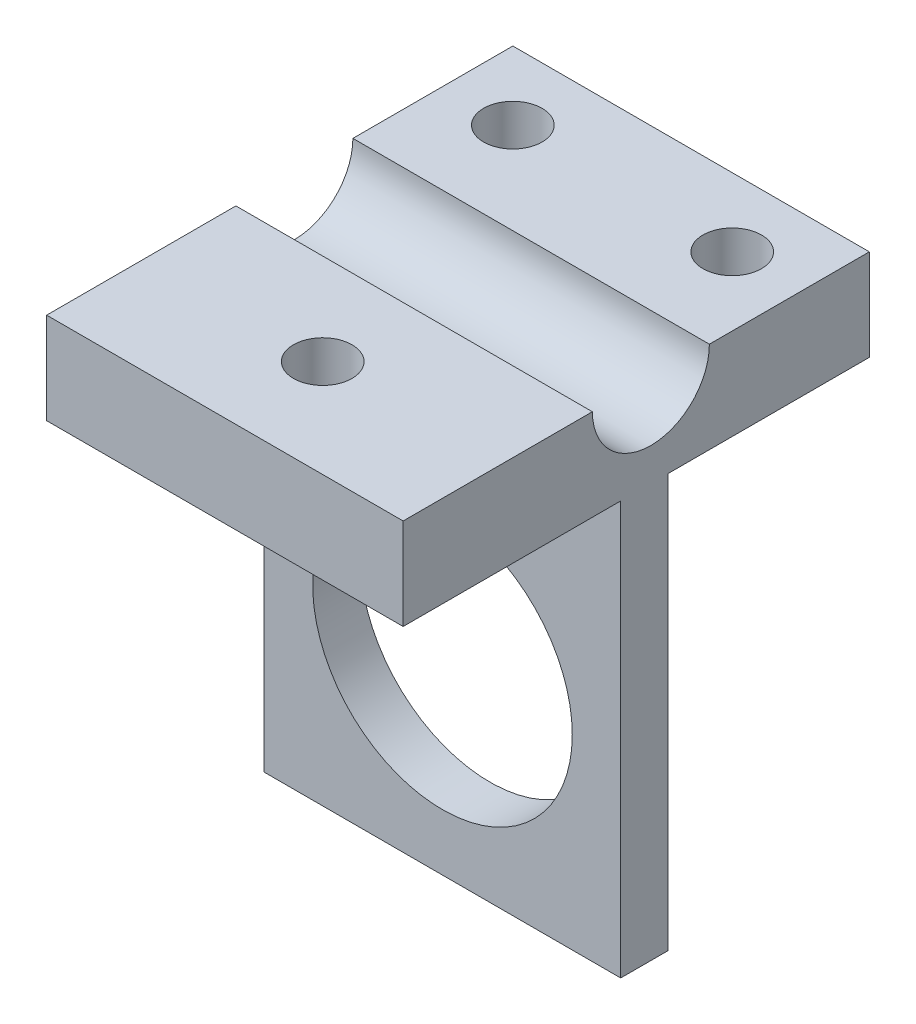
ISO-10303-21;
HEADER;
FILE_DESCRIPTION(('STEP AP214'),'2;1');
FILE_NAME('part.step','',(''),(''),'','','');
FILE_SCHEMA(('AUTOMOTIVE_DESIGN { 1 0 10303 214 1 1 1 1 }'));
ENDSEC;
DATA;
#1=APPLICATION_CONTEXT('core data for automotive mechanical design processes');
#2=APPLICATION_PROTOCOL_DEFINITION('international standard','automotive_design',2000,#1);
#3=PRODUCT_CONTEXT('',#1,'mechanical');
#4=PRODUCT('Part','Part','',(#3));
#5=PRODUCT_RELATED_PRODUCT_CATEGORY('part','',(#4));
#6=PRODUCT_DEFINITION_FORMATION('','',#4);
#7=PRODUCT_DEFINITION_CONTEXT('part definition',#1,'design');
#8=PRODUCT_DEFINITION('design','',#6,#7);
#9=PRODUCT_DEFINITION_SHAPE('','',#8);
#10=(LENGTH_UNIT() NAMED_UNIT(*) SI_UNIT(.MILLI.,.METRE.));
#11=(NAMED_UNIT(*) PLANE_ANGLE_UNIT() SI_UNIT($,.RADIAN.));
#12=(NAMED_UNIT(*) SI_UNIT($,.STERADIAN.) SOLID_ANGLE_UNIT());
#13=UNCERTAINTY_MEASURE_WITH_UNIT(LENGTH_MEASURE(1.E-05),#10,'distance_accuracy_value','');
#14=(GEOMETRIC_REPRESENTATION_CONTEXT(3) GLOBAL_UNCERTAINTY_ASSIGNED_CONTEXT((#13)) GLOBAL_UNIT_ASSIGNED_CONTEXT((#10,
#11,#12)) REPRESENTATION_CONTEXT('',''));
#15=CARTESIAN_POINT('',(0.,0.,0.));
#16=DIRECTION('',(0.,0.,1.));
#17=DIRECTION('',(1.,0.,0.));
#18=AXIS2_PLACEMENT_3D('',#15,#16,#17);
#19=CARTESIAN_POINT('',(0.,0.,0.));
#20=DIRECTION('',(0.,-1.,0.));
#21=DIRECTION('',(0.,0.,-1.));
#22=AXIS2_PLACEMENT_3D('',#19,#20,#21);
#23=PLANE('',#22);
#24=DIRECTION('',(1.,0.,0.));
#25=VECTOR('',#24,1.);
#26=CARTESIAN_POINT('',(24.765,0.,-18.415));
#27=LINE('',#26,#25);
#28=CARTESIAN_POINT('',(0.,0.,-18.415));
#29=VERTEX_POINT('',#28);
#30=CARTESIAN_POINT('',(24.765,0.,-18.415));
#31=VERTEX_POINT('',#30);
#32=EDGE_CURVE('E140',#29,#31,#27,.T.);
#33=ORIENTED_EDGE('',*,*,#32,.F.);
#34=DIRECTION('',(0.,0.,1.));
#35=VECTOR('',#34,1.);
#36=CARTESIAN_POINT('',(0.,0.,0.));
#37=LINE('',#36,#35);
#38=CARTESIAN_POINT('',(0.,0.,-32.385));
#39=VERTEX_POINT('',#38);
#40=EDGE_CURVE('E191',#39,#29,#37,.T.);
#41=ORIENTED_EDGE('',*,*,#40,.F.);
#42=DIRECTION('',(-1.,0.,0.));
#43=VECTOR('',#42,1.);
#44=CARTESIAN_POINT('',(0.,0.,-32.385));
#45=LINE('',#44,#43);
#46=CARTESIAN_POINT('',(24.765,0.,-32.385));
#47=VERTEX_POINT('',#46);
#48=EDGE_CURVE('E197',#47,#39,#45,.T.);
#49=ORIENTED_EDGE('',*,*,#48,.F.);
#50=DIRECTION('',(0.,0.,-1.));
#51=VECTOR('',#50,1.);
#52=CARTESIAN_POINT('',(24.765,0.,0.));
#53=LINE('',#52,#51);
#54=EDGE_CURVE('E58',#31,#47,#53,.T.);
#55=ORIENTED_EDGE('',*,*,#54,.F.);
#56=EDGE_LOOP('',(#33,#41,#49,#55));
#57=FACE_BOUND('',#56,.T.);
#58=CARTESIAN_POINT('',(4.7625,0.,-27.6225));
#59=DIRECTION('',(0.,1.,0.));
#60=DIRECTION('',(0.,0.,1.));
#61=AXIS2_PLACEMENT_3D('',#58,#59,#60);
#62=CIRCLE('',#61,2.032);
#63=CARTESIAN_POINT('',(4.7625,0.,-25.5905));
#64=VERTEX_POINT('',#63);
#65=EDGE_CURVE('E169',#64,#64,#62,.T.);
#66=ORIENTED_EDGE('',*,*,#65,.T.);
#67=EDGE_LOOP('',(#66));
#68=FACE_BOUND('',#67,.T.);
#69=CARTESIAN_POINT('',(20.0025,0.,-27.6225));
#70=DIRECTION('',(0.,1.,0.));
#71=DIRECTION('',(0.,0.,1.));
#72=AXIS2_PLACEMENT_3D('',#69,#70,#71);
#73=CIRCLE('',#72,2.032);
#74=CARTESIAN_POINT('',(20.0025,0.,-25.5905));
#75=VERTEX_POINT('',#74);
#76=EDGE_CURVE('E163',#75,#75,#73,.T.);
#77=ORIENTED_EDGE('',*,*,#76,.T.);
#78=EDGE_LOOP('',(#77));
#79=FACE_BOUND('',#78,.T.);
#80=ADVANCED_FACE('F43',(#57,#68,#79),#23,.T.);
#81=CARTESIAN_POINT('',(0.,6.35,0.));
#82=DIRECTION('',(0.,-1.,0.));
#83=DIRECTION('',(0.,0.,-1.));
#84=AXIS2_PLACEMENT_3D('',#81,#82,#83);
#85=PLANE('',#84);
#86=CARTESIAN_POINT('',(12.3825,6.35,-6.7945));
#87=DIRECTION('',(0.,1.,0.));
#88=DIRECTION('',(0.,0.,1.));
#89=AXIS2_PLACEMENT_3D('',#86,#87,#88);
#90=CIRCLE('',#89,2.032);
#91=CARTESIAN_POINT('',(12.3825,6.35,-4.7625));
#92=VERTEX_POINT('',#91);
#93=EDGE_CURVE('E160',#92,#92,#90,.T.);
#94=ORIENTED_EDGE('',*,*,#93,.F.);
#95=EDGE_LOOP('',(#94));
#96=FACE_BOUND('',#95,.T.);
#97=DIRECTION('',(0.,0.,-1.));
#98=VECTOR('',#97,1.);
#99=CARTESIAN_POINT('',(24.765,6.35,0.));
#100=LINE('',#99,#98);
#101=CARTESIAN_POINT('',(24.765,6.35,0.));
#102=VERTEX_POINT('',#101);
#103=CARTESIAN_POINT('',(24.765,6.35,-13.1445));
#104=VERTEX_POINT('',#103);
#105=EDGE_CURVE('E185',#102,#104,#100,.T.);
#106=ORIENTED_EDGE('',*,*,#105,.T.);
#107=DIRECTION('',(-1.,0.,0.));
#108=VECTOR('',#107,1.);
#109=CARTESIAN_POINT('',(0.,6.35,-13.1445));
#110=LINE('',#109,#108);
#111=CARTESIAN_POINT('',(0.,6.35,-13.1445));
#112=VERTEX_POINT('',#111);
#113=EDGE_CURVE('E156',#104,#112,#110,.T.);
#114=ORIENTED_EDGE('',*,*,#113,.T.);
#115=DIRECTION('',(0.,0.,1.));
#116=VECTOR('',#115,1.);
#117=CARTESIAN_POINT('',(0.,6.35,0.));
#118=LINE('',#117,#116);
#119=CARTESIAN_POINT('',(0.,6.35,0.));
#120=VERTEX_POINT('',#119);
#121=EDGE_CURVE('E182',#112,#120,#118,.T.);
#122=ORIENTED_EDGE('',*,*,#121,.T.);
#123=DIRECTION('',(1.,0.,0.));
#124=VECTOR('',#123,1.);
#125=CARTESIAN_POINT('',(0.,6.35,0.));
#126=LINE('',#125,#124);
#127=EDGE_CURVE('E181',#120,#102,#126,.T.);
#128=ORIENTED_EDGE('',*,*,#127,.T.);
#129=EDGE_LOOP('',(#106,#114,#122,#128));
#130=FACE_BOUND('',#129,.T.);
#131=ADVANCED_FACE('F239',(#96,#130),#85,.F.);
#132=CARTESIAN_POINT('',(0.,6.35,-32.385));
#133=VERTEX_POINT('',#132);
#134=CARTESIAN_POINT('',(0.,6.35,-21.2725));
#135=VERTEX_POINT('',#134);
#136=EDGE_CURVE('E178',#133,#135,#118,.T.);
#137=ORIENTED_EDGE('',*,*,#136,.T.);
#138=DIRECTION('',(-1.,0.,0.));
#139=VECTOR('',#138,1.);
#140=CARTESIAN_POINT('',(0.,6.35,-21.2725));
#141=LINE('',#140,#139);
#142=CARTESIAN_POINT('',(24.765,6.35,-21.2725));
#143=VERTEX_POINT('',#142);
#144=EDGE_CURVE('E148',#135,#143,#141,.F.);
#145=ORIENTED_EDGE('',*,*,#144,.T.);
#146=CARTESIAN_POINT('',(24.765,6.35,-32.385));
#147=VERTEX_POINT('',#146);
#148=EDGE_CURVE('E184',#143,#147,#100,.T.);
#149=ORIENTED_EDGE('',*,*,#148,.T.);
#150=DIRECTION('',(-1.,0.,0.));
#151=VECTOR('',#150,1.);
#152=CARTESIAN_POINT('',(0.,6.35,-32.385));
#153=LINE('',#152,#151);
#154=EDGE_CURVE('E188',#147,#133,#153,.T.);
#155=ORIENTED_EDGE('',*,*,#154,.T.);
#156=EDGE_LOOP('',(#137,#145,#149,#155));
#157=FACE_BOUND('',#156,.T.);
#158=CARTESIAN_POINT('',(4.7625,6.35,-27.6225));
#159=DIRECTION('',(0.,1.,0.));
#160=DIRECTION('',(0.,0.,1.));
#161=AXIS2_PLACEMENT_3D('',#158,#159,#160);
#162=CIRCLE('',#161,2.032);
#163=CARTESIAN_POINT('',(4.7625,6.35,-25.5905));
#164=VERTEX_POINT('',#163);
#165=EDGE_CURVE('E172',#164,#164,#162,.T.);
#166=ORIENTED_EDGE('',*,*,#165,.F.);
#167=EDGE_LOOP('',(#166));
#168=FACE_BOUND('',#167,.T.);
#169=CARTESIAN_POINT('',(20.0025,6.35,-27.6225));
#170=DIRECTION('',(0.,1.,0.));
#171=DIRECTION('',(0.,0.,1.));
#172=AXIS2_PLACEMENT_3D('',#169,#170,#171);
#173=CIRCLE('',#172,2.032);
#174=CARTESIAN_POINT('',(20.0025,6.35,-25.5905));
#175=VERTEX_POINT('',#174);
#176=EDGE_CURVE('E166',#175,#175,#173,.T.);
#177=ORIENTED_EDGE('',*,*,#176,.F.);
#178=EDGE_LOOP('',(#177));
#179=FACE_BOUND('',#178,.T.);
#180=ADVANCED_FACE('F218',(#157,#168,#179),#85,.F.);
#181=DIRECTION('',(-1.,0.,0.));
#182=VECTOR('',#181,1.);
#183=CARTESIAN_POINT('',(24.765,0.,-15.113));
#184=LINE('',#183,#182);
#185=CARTESIAN_POINT('',(24.765,0.,-15.113));
#186=VERTEX_POINT('',#185);
#187=CARTESIAN_POINT('',(0.,0.,-15.113));
#188=VERTEX_POINT('',#187);
#189=EDGE_CURVE('E66',#186,#188,#184,.T.);
#190=ORIENTED_EDGE('',*,*,#189,.F.);
#191=CARTESIAN_POINT('',(24.765,0.,0.));
#192=VERTEX_POINT('',#191);
#193=EDGE_CURVE('E145',#192,#186,#53,.T.);
#194=ORIENTED_EDGE('',*,*,#193,.F.);
#195=DIRECTION('',(1.,0.,0.));
#196=VECTOR('',#195,1.);
#197=CARTESIAN_POINT('',(0.,0.,0.));
#198=LINE('',#197,#196);
#199=CARTESIAN_POINT('',(0.,0.,0.));
#200=VERTEX_POINT('',#199);
#201=EDGE_CURVE('E194',#200,#192,#198,.T.);
#202=ORIENTED_EDGE('',*,*,#201,.F.);
#203=EDGE_CURVE('E175',#188,#200,#37,.T.);
#204=ORIENTED_EDGE('',*,*,#203,.F.);
#205=EDGE_LOOP('',(#190,#194,#202,#204));
#206=FACE_BOUND('',#205,.T.);
#207=CARTESIAN_POINT('',(12.3825,0.,-6.7945));
#208=DIRECTION('',(0.,1.,0.));
#209=DIRECTION('',(0.,0.,1.));
#210=AXIS2_PLACEMENT_3D('',#207,#208,#209);
#211=CIRCLE('',#210,2.032);
#212=CARTESIAN_POINT('',(12.3825,0.,-4.7625));
#213=VERTEX_POINT('',#212);
#214=EDGE_CURVE('E159',#213,#213,#211,.T.);
#215=ORIENTED_EDGE('',*,*,#214,.T.);
#216=EDGE_LOOP('',(#215));
#217=FACE_BOUND('',#216,.T.);
#218=ADVANCED_FACE('F215',(#206,#217),#23,.T.);
#219=CARTESIAN_POINT('',(0.,6.35,0.));
#220=DIRECTION('',(1.,0.,0.));
#221=DIRECTION('',(0.,0.,-1.));
#222=AXIS2_PLACEMENT_3D('',#219,#220,#221);
#223=PLANE('',#222);
#224=ORIENTED_EDGE('',*,*,#121,.F.);
#225=CARTESIAN_POINT('',(0.,6.35,-17.2085));
#226=DIRECTION('',(-1.,0.,0.));
#227=DIRECTION('',(0.,0.,1.));
#228=AXIS2_PLACEMENT_3D('',#225,#226,#227);
#229=CIRCLE('',#228,4.064);
#230=EDGE_CURVE('E146',#135,#112,#229,.T.);
#231=ORIENTED_EDGE('',*,*,#230,.F.);
#232=ORIENTED_EDGE('',*,*,#136,.F.);
#233=DIRECTION('',(0.,-1.,0.));
#234=VECTOR('',#233,1.);
#235=CARTESIAN_POINT('',(0.,6.35,-32.385));
#236=LINE('',#235,#234);
#237=EDGE_CURVE('E190',#133,#39,#236,.T.);
#238=ORIENTED_EDGE('',*,*,#237,.T.);
#239=ORIENTED_EDGE('',*,*,#40,.T.);
#240=DIRECTION('',(0.,1.,0.));
#241=VECTOR('',#240,1.);
#242=CARTESIAN_POINT('',(0.,-28.702,-18.415));
#243=LINE('',#242,#241);
#244=CARTESIAN_POINT('',(0.,-28.702,-18.415));
#245=VERTEX_POINT('',#244);
#246=EDGE_CURVE('E150',#245,#29,#243,.T.);
#247=ORIENTED_EDGE('',*,*,#246,.F.);
#248=DIRECTION('',(0.,0.,-1.));
#249=VECTOR('',#248,1.);
#250=CARTESIAN_POINT('',(0.,-28.702,-18.415));
#251=LINE('',#250,#249);
#252=CARTESIAN_POINT('',(0.,-28.702,-15.113));
#253=VERTEX_POINT('',#252);
#254=EDGE_CURVE('E130',#253,#245,#251,.T.);
#255=ORIENTED_EDGE('',*,*,#254,.F.);
#256=DIRECTION('',(0.,1.,0.));
#257=VECTOR('',#256,1.);
#258=CARTESIAN_POINT('',(0.,-28.702,-15.113));
#259=LINE('',#258,#257);
#260=EDGE_CURVE('E127',#253,#188,#259,.T.);
#261=ORIENTED_EDGE('',*,*,#260,.T.);
#262=ORIENTED_EDGE('',*,*,#203,.T.);
#263=DIRECTION('',(0.,-1.,0.));
#264=VECTOR('',#263,1.);
#265=CARTESIAN_POINT('',(0.,6.35,0.));
#266=LINE('',#265,#264);
#267=EDGE_CURVE('E51',#120,#200,#266,.T.);
#268=ORIENTED_EDGE('',*,*,#267,.F.);
#269=EDGE_LOOP('',(#224,#231,#232,#238,#239,#247,#255,#261,#262,#268));
#270=FACE_BOUND('',#269,.T.);
#271=ADVANCED_FACE('F45',(#270),#223,.F.);
#272=CARTESIAN_POINT('',(0.,6.35,0.));
#273=DIRECTION('',(0.,0.,-1.));
#274=DIRECTION('',(-1.,0.,0.));
#275=AXIS2_PLACEMENT_3D('',#272,#273,#274);
#276=PLANE('',#275);
#277=ORIENTED_EDGE('',*,*,#201,.T.);
#278=DIRECTION('',(0.,-1.,0.));
#279=VECTOR('',#278,1.);
#280=CARTESIAN_POINT('',(24.765,6.35,0.));
#281=LINE('',#280,#279);
#282=EDGE_CURVE('E204',#102,#192,#281,.T.);
#283=ORIENTED_EDGE('',*,*,#282,.F.);
#284=ORIENTED_EDGE('',*,*,#127,.F.);
#285=ORIENTED_EDGE('',*,*,#267,.T.);
#286=EDGE_LOOP('',(#277,#283,#284,#285));
#287=FACE_BOUND('',#286,.T.);
#288=ADVANCED_FACE('F209',(#287),#276,.F.);
#289=CARTESIAN_POINT('',(24.765,6.35,0.));
#290=DIRECTION('',(-1.,0.,0.));
#291=DIRECTION('',(0.,0.,1.));
#292=AXIS2_PLACEMENT_3D('',#289,#290,#291);
#293=PLANE('',#292);
#294=ORIENTED_EDGE('',*,*,#148,.F.);
#295=CARTESIAN_POINT('',(24.765,6.35,-17.2085));
#296=DIRECTION('',(-1.,0.,0.));
#297=DIRECTION('',(0.,0.,1.));
#298=AXIS2_PLACEMENT_3D('',#295,#296,#297);
#299=CIRCLE('',#298,4.064);
#300=EDGE_CURVE('E11',#143,#104,#299,.T.);
#301=ORIENTED_EDGE('',*,*,#300,.T.);
#302=ORIENTED_EDGE('',*,*,#105,.F.);
#303=ORIENTED_EDGE('',*,*,#282,.T.);
#304=ORIENTED_EDGE('',*,*,#193,.T.);
#305=DIRECTION('',(0.,1.,0.));
#306=VECTOR('',#305,1.);
#307=CARTESIAN_POINT('',(24.765,-28.702,-15.113));
#308=LINE('',#307,#306);
#309=CARTESIAN_POINT('',(24.765,-28.702,-15.113));
#310=VERTEX_POINT('',#309);
#311=EDGE_CURVE('E125',#310,#186,#308,.T.);
#312=ORIENTED_EDGE('',*,*,#311,.F.);
#313=DIRECTION('',(0.,0.,1.));
#314=VECTOR('',#313,1.);
#315=CARTESIAN_POINT('',(24.765,-28.702,-18.415));
#316=LINE('',#315,#314);
#317=CARTESIAN_POINT('',(24.765,-28.702,-18.415));
#318=VERTEX_POINT('',#317);
#319=EDGE_CURVE('E131',#318,#310,#316,.T.);
#320=ORIENTED_EDGE('',*,*,#319,.F.);
#321=DIRECTION('',(0.,1.,0.));
#322=VECTOR('',#321,1.);
#323=CARTESIAN_POINT('',(24.765,-28.702,-18.415));
#324=LINE('',#323,#322);
#325=EDGE_CURVE('E385',#318,#31,#324,.T.);
#326=ORIENTED_EDGE('',*,*,#325,.T.);
#327=ORIENTED_EDGE('',*,*,#54,.T.);
#328=DIRECTION('',(0.,-1.,0.));
#329=VECTOR('',#328,1.);
#330=CARTESIAN_POINT('',(24.765,6.35,-32.385));
#331=LINE('',#330,#329);
#332=EDGE_CURVE('E201',#147,#47,#331,.T.);
#333=ORIENTED_EDGE('',*,*,#332,.F.);
#334=EDGE_LOOP('',(#294,#301,#302,#303,#304,#312,#320,#326,#327,#333));
#335=FACE_BOUND('',#334,.T.);
#336=ADVANCED_FACE('F143',(#335),#293,.F.);
#337=CARTESIAN_POINT('',(0.,6.35,-32.385));
#338=DIRECTION('',(0.,0.,1.));
#339=DIRECTION('',(1.,0.,0.));
#340=AXIS2_PLACEMENT_3D('',#337,#338,#339);
#341=PLANE('',#340);
#342=ORIENTED_EDGE('',*,*,#48,.T.);
#343=ORIENTED_EDGE('',*,*,#237,.F.);
#344=ORIENTED_EDGE('',*,*,#154,.F.);
#345=ORIENTED_EDGE('',*,*,#332,.T.);
#346=EDGE_LOOP('',(#342,#343,#344,#345));
#347=FACE_BOUND('',#346,.T.);
#348=ADVANCED_FACE('F247',(#347),#341,.F.);
#349=CARTESIAN_POINT('',(4.7625,6.35,-27.6225));
#350=DIRECTION('',(0.,-1.,0.));
#351=DIRECTION('',(0.,0.,-1.));
#352=AXIS2_PLACEMENT_3D('',#349,#350,#351);
#353=CYLINDRICAL_SURFACE('',#352,2.032);
#354=ORIENTED_EDGE('',*,*,#165,.T.);
#355=EDGE_LOOP('',(#354));
#356=FACE_BOUND('',#355,.T.);
#357=ORIENTED_EDGE('',*,*,#65,.F.);
#358=EDGE_LOOP('',(#357));
#359=FACE_BOUND('',#358,.T.);
#360=ADVANCED_FACE('F235',(#356,#359),#353,.F.);
#361=CARTESIAN_POINT('',(20.0025,6.35,-27.6225));
#362=DIRECTION('',(0.,-1.,0.));
#363=DIRECTION('',(0.,0.,-1.));
#364=AXIS2_PLACEMENT_3D('',#361,#362,#363);
#365=CYLINDRICAL_SURFACE('',#364,2.032);
#366=ORIENTED_EDGE('',*,*,#176,.T.);
#367=EDGE_LOOP('',(#366));
#368=FACE_BOUND('',#367,.T.);
#369=ORIENTED_EDGE('',*,*,#76,.F.);
#370=EDGE_LOOP('',(#369));
#371=FACE_BOUND('',#370,.T.);
#372=ADVANCED_FACE('F225',(#368,#371),#365,.F.);
#373=CARTESIAN_POINT('',(12.3825,6.35,-6.7945));
#374=DIRECTION('',(0.,-1.,0.));
#375=DIRECTION('',(0.,0.,-1.));
#376=AXIS2_PLACEMENT_3D('',#373,#374,#375);
#377=CYLINDRICAL_SURFACE('',#376,2.032);
#378=ORIENTED_EDGE('',*,*,#93,.T.);
#379=EDGE_LOOP('',(#378));
#380=FACE_BOUND('',#379,.T.);
#381=ORIENTED_EDGE('',*,*,#214,.F.);
#382=EDGE_LOOP('',(#381));
#383=FACE_BOUND('',#382,.T.);
#384=ADVANCED_FACE('F222',(#380,#383),#377,.F.);
#385=CARTESIAN_POINT('',(0.,6.35,-17.2085));
#386=DIRECTION('',(-1.,0.,0.));
#387=DIRECTION('',(0.,0.,1.));
#388=AXIS2_PLACEMENT_3D('',#385,#386,#387);
#389=CYLINDRICAL_SURFACE('',#388,4.064);
#390=ORIENTED_EDGE('',*,*,#300,.F.);
#391=ORIENTED_EDGE('',*,*,#144,.F.);
#392=ORIENTED_EDGE('',*,*,#230,.T.);
#393=ORIENTED_EDGE('',*,*,#113,.F.);
#394=EDGE_LOOP('',(#390,#391,#392,#393));
#395=FACE_BOUND('',#394,.T.);
#396=ADVANCED_FACE('F224',(#395),#389,.F.);
#397=CARTESIAN_POINT('',(24.765,-28.702,-15.113));
#398=DIRECTION('',(0.,0.,-1.));
#399=DIRECTION('',(-1.,0.,0.));
#400=AXIS2_PLACEMENT_3D('',#397,#398,#399);
#401=PLANE('',#400);
#402=CARTESIAN_POINT('',(12.3825,-15.748,-15.113));
#403=DIRECTION('',(0.,0.,1.));
#404=DIRECTION('',(1.,0.,0.));
#405=AXIS2_PLACEMENT_3D('',#402,#403,#404);
#406=CIRCLE('',#405,9.017);
#407=CARTESIAN_POINT('',(21.3995,-15.748,-15.113));
#408=VERTEX_POINT('',#407);
#409=EDGE_CURVE('E395',#408,#408,#406,.T.);
#410=ORIENTED_EDGE('',*,*,#409,.F.);
#411=EDGE_LOOP('',(#410));
#412=FACE_BOUND('',#411,.T.);
#413=ORIENTED_EDGE('',*,*,#189,.T.);
#414=ORIENTED_EDGE('',*,*,#260,.F.);
#415=DIRECTION('',(-1.,0.,0.));
#416=VECTOR('',#415,1.);
#417=CARTESIAN_POINT('',(24.765,-28.702,-15.113));
#418=LINE('',#417,#416);
#419=EDGE_CURVE('E121',#310,#253,#418,.T.);
#420=ORIENTED_EDGE('',*,*,#419,.F.);
#421=ORIENTED_EDGE('',*,*,#311,.T.);
#422=EDGE_LOOP('',(#413,#414,#420,#421));
#423=FACE_BOUND('',#422,.T.);
#424=ADVANCED_FACE('F123',(#412,#423),#401,.F.);
#425=CARTESIAN_POINT('',(24.765,-28.702,-18.415));
#426=DIRECTION('',(0.,0.,1.));
#427=DIRECTION('',(1.,0.,0.));
#428=AXIS2_PLACEMENT_3D('',#425,#426,#427);
#429=PLANE('',#428);
#430=CARTESIAN_POINT('',(12.3825,-15.748,-18.415));
#431=DIRECTION('',(0.,0.,1.));
#432=DIRECTION('',(1.,0.,0.));
#433=AXIS2_PLACEMENT_3D('',#430,#431,#432);
#434=CIRCLE('',#433,9.017);
#435=CARTESIAN_POINT('',(21.3995,-15.748,-18.415));
#436=VERTEX_POINT('',#435);
#437=EDGE_CURVE('E390',#436,#436,#434,.F.);
#438=ORIENTED_EDGE('',*,*,#437,.F.);
#439=EDGE_LOOP('',(#438));
#440=FACE_BOUND('',#439,.T.);
#441=ORIENTED_EDGE('',*,*,#32,.T.);
#442=ORIENTED_EDGE('',*,*,#325,.F.);
#443=DIRECTION('',(1.,0.,0.));
#444=VECTOR('',#443,1.);
#445=CARTESIAN_POINT('',(24.765,-28.702,-18.415));
#446=LINE('',#445,#444);
#447=EDGE_CURVE('E136',#245,#318,#446,.T.);
#448=ORIENTED_EDGE('',*,*,#447,.F.);
#449=ORIENTED_EDGE('',*,*,#246,.T.);
#450=EDGE_LOOP('',(#441,#442,#448,#449));
#451=FACE_BOUND('',#450,.T.);
#452=ADVANCED_FACE('F275',(#440,#451),#429,.F.);
#453=CARTESIAN_POINT('',(0.,-28.702,0.));
#454=DIRECTION('',(0.,-1.,0.));
#455=DIRECTION('',(0.,0.,-1.));
#456=AXIS2_PLACEMENT_3D('',#453,#454,#455);
#457=PLANE('',#456);
#458=ORIENTED_EDGE('',*,*,#319,.T.);
#459=ORIENTED_EDGE('',*,*,#419,.T.);
#460=ORIENTED_EDGE('',*,*,#254,.T.);
#461=ORIENTED_EDGE('',*,*,#447,.T.);
#462=EDGE_LOOP('',(#458,#459,#460,#461));
#463=FACE_BOUND('',#462,.T.);
#464=ADVANCED_FACE('F134',(#463),#457,.T.);
#465=CARTESIAN_POINT('',(12.3825,-15.748,-32.386));
#466=DIRECTION('',(0.,0.,1.));
#467=DIRECTION('',(1.,0.,0.));
#468=AXIS2_PLACEMENT_3D('',#465,#466,#467);
#469=CYLINDRICAL_SURFACE('',#468,9.017);
#470=ORIENTED_EDGE('',*,*,#409,.T.);
#471=EDGE_LOOP('',(#470));
#472=FACE_BOUND('',#471,.T.);
#473=ORIENTED_EDGE('',*,*,#437,.T.);
#474=EDGE_LOOP('',(#473));
#475=FACE_BOUND('',#474,.T.);
#476=ADVANCED_FACE('F274',(#472,#475),#469,.F.);
#477=CLOSED_SHELL('',(#80,#131,#180,#218,#271,#288,#336,#348,#360,#372,#384,#396,#424,#452,#464,#476));
#478=MANIFOLD_SOLID_BREP('B2',#477);
#479=ADVANCED_BREP_SHAPE_REPRESENTATION('',(#18,#478),#14);
#480=SHAPE_DEFINITION_REPRESENTATION(#9,#479);
ENDSEC;
END-ISO-10303-21;
